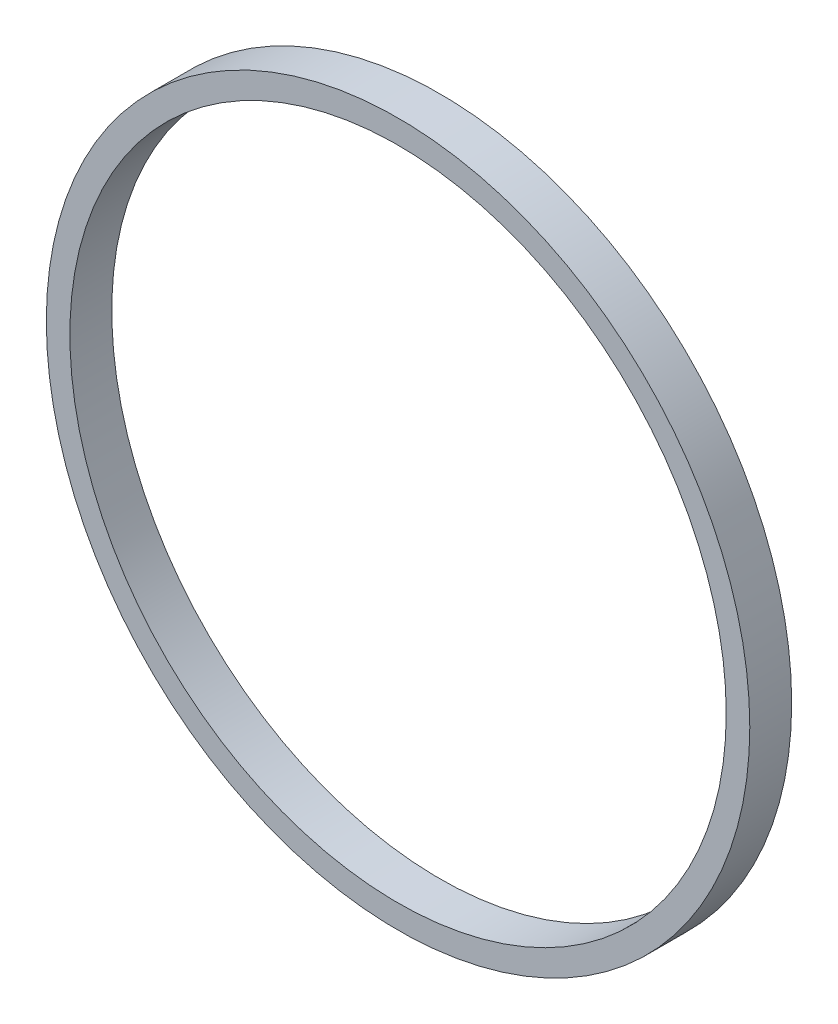
ISO-10303-21;
HEADER;
FILE_DESCRIPTION(('STEP AP214'),'2;1');
FILE_NAME('part.step','',(''),(''),'','','');
FILE_SCHEMA(('AUTOMOTIVE_DESIGN { 1 0 10303 214 1 1 1 1 }'));
ENDSEC;
DATA;
#1=APPLICATION_CONTEXT('core data for automotive mechanical design processes');
#2=APPLICATION_PROTOCOL_DEFINITION('international standard','automotive_design',2000,#1);
#3=PRODUCT_CONTEXT('',#1,'mechanical');
#4=PRODUCT('Part','Part','',(#3));
#5=PRODUCT_RELATED_PRODUCT_CATEGORY('part','',(#4));
#6=PRODUCT_DEFINITION_FORMATION('','',#4);
#7=PRODUCT_DEFINITION_CONTEXT('part definition',#1,'design');
#8=PRODUCT_DEFINITION('design','',#6,#7);
#9=PRODUCT_DEFINITION_SHAPE('','',#8);
#10=(LENGTH_UNIT() NAMED_UNIT(*) SI_UNIT(.MILLI.,.METRE.));
#11=(NAMED_UNIT(*) PLANE_ANGLE_UNIT() SI_UNIT($,.RADIAN.));
#12=(NAMED_UNIT(*) SI_UNIT($,.STERADIAN.) SOLID_ANGLE_UNIT());
#13=UNCERTAINTY_MEASURE_WITH_UNIT(LENGTH_MEASURE(1.E-05),#10,'distance_accuracy_value','');
#14=(GEOMETRIC_REPRESENTATION_CONTEXT(3) GLOBAL_UNCERTAINTY_ASSIGNED_CONTEXT((#13)) GLOBAL_UNIT_ASSIGNED_CONTEXT((#10,
#11,#12)) REPRESENTATION_CONTEXT('',''));
#15=CARTESIAN_POINT('',(0.,0.,0.));
#16=DIRECTION('',(0.,0.,1.));
#17=DIRECTION('',(1.,0.,0.));
#18=AXIS2_PLACEMENT_3D('',#15,#16,#17);
#19=CARTESIAN_POINT('',(0.,0.,3.2));
#20=DIRECTION('',(0.,0.,1.));
#21=DIRECTION('',(1.,0.,0.));
#22=AXIS2_PLACEMENT_3D('',#19,#20,#21);
#23=PLANE('',#22);
#24=CARTESIAN_POINT('',(0.,0.,3.2));
#25=DIRECTION('',(0.,0.,1.));
#26=DIRECTION('',(1.,0.,0.));
#27=AXIS2_PLACEMENT_3D('',#24,#25,#26);
#28=CIRCLE('',#27,26.87);
#29=CARTESIAN_POINT('',(26.87,0.,3.2));
#30=VERTEX_POINT('',#29);
#31=EDGE_CURVE('E10',#30,#30,#28,.T.);
#32=ORIENTED_EDGE('',*,*,#31,.T.);
#33=EDGE_LOOP('',(#32));
#34=FACE_BOUND('',#33,.T.);
#35=CARTESIAN_POINT('',(0.,0.,3.2));
#36=DIRECTION('',(0.,0.,1.));
#37=DIRECTION('',(1.,0.,0.));
#38=AXIS2_PLACEMENT_3D('',#35,#36,#37);
#39=CIRCLE('',#38,25.07);
#40=CARTESIAN_POINT('',(25.07,0.,3.2));
#41=VERTEX_POINT('',#40);
#42=EDGE_CURVE('E54',#41,#41,#39,.T.);
#43=ORIENTED_EDGE('',*,*,#42,.F.);
#44=EDGE_LOOP('',(#43));
#45=FACE_BOUND('',#44,.T.);
#46=ADVANCED_FACE('F43',(#34,#45),#23,.T.);
#47=CARTESIAN_POINT('',(0.,0.,0.));
#48=DIRECTION('',(0.,0.,1.));
#49=DIRECTION('',(1.,0.,0.));
#50=AXIS2_PLACEMENT_3D('',#47,#48,#49);
#51=PLANE('',#50);
#52=CARTESIAN_POINT('',(0.,0.,0.));
#53=DIRECTION('',(0.,0.,1.));
#54=DIRECTION('',(1.,0.,0.));
#55=AXIS2_PLACEMENT_3D('',#52,#53,#54);
#56=CIRCLE('',#55,26.87);
#57=CARTESIAN_POINT('',(26.87,0.,0.));
#58=VERTEX_POINT('',#57);
#59=EDGE_CURVE('E47',#58,#58,#56,.T.);
#60=ORIENTED_EDGE('',*,*,#59,.F.);
#61=EDGE_LOOP('',(#60));
#62=FACE_BOUND('',#61,.T.);
#63=CARTESIAN_POINT('',(0.,0.,0.));
#64=DIRECTION('',(0.,0.,1.));
#65=DIRECTION('',(1.,0.,0.));
#66=AXIS2_PLACEMENT_3D('',#63,#64,#65);
#67=CIRCLE('',#66,25.07);
#68=CARTESIAN_POINT('',(25.07,0.,0.));
#69=VERTEX_POINT('',#68);
#70=EDGE_CURVE('E56',#69,#69,#67,.T.);
#71=ORIENTED_EDGE('',*,*,#70,.T.);
#72=EDGE_LOOP('',(#71));
#73=FACE_BOUND('',#72,.T.);
#74=ADVANCED_FACE('F66',(#62,#73),#51,.F.);
#75=CARTESIAN_POINT('',(0.,0.,3.2));
#76=DIRECTION('',(0.,0.,-1.));
#77=DIRECTION('',(-1.,0.,0.));
#78=AXIS2_PLACEMENT_3D('',#75,#76,#77);
#79=CYLINDRICAL_SURFACE('',#78,26.87);
#80=ORIENTED_EDGE('',*,*,#31,.F.);
#81=EDGE_LOOP('',(#80));
#82=FACE_BOUND('',#81,.T.);
#83=ORIENTED_EDGE('',*,*,#59,.T.);
#84=EDGE_LOOP('',(#83));
#85=FACE_BOUND('',#84,.T.);
#86=ADVANCED_FACE('F45',(#82,#85),#79,.T.);
#87=CARTESIAN_POINT('',(0.,0.,3.2));
#88=DIRECTION('',(0.,0.,-1.));
#89=DIRECTION('',(-1.,0.,0.));
#90=AXIS2_PLACEMENT_3D('',#87,#88,#89);
#91=CYLINDRICAL_SURFACE('',#90,25.07);
#92=ORIENTED_EDGE('',*,*,#42,.T.);
#93=EDGE_LOOP('',(#92));
#94=FACE_BOUND('',#93,.T.);
#95=ORIENTED_EDGE('',*,*,#70,.F.);
#96=EDGE_LOOP('',(#95));
#97=FACE_BOUND('',#96,.T.);
#98=ADVANCED_FACE('F62',(#94,#97),#91,.F.);
#99=CLOSED_SHELL('',(#46,#74,#86,#98));
#100=MANIFOLD_SOLID_BREP('B2',#99);
#101=ADVANCED_BREP_SHAPE_REPRESENTATION('',(#18,#100),#14);
#102=SHAPE_DEFINITION_REPRESENTATION(#9,#101);
ENDSEC;
END-ISO-10303-21;
